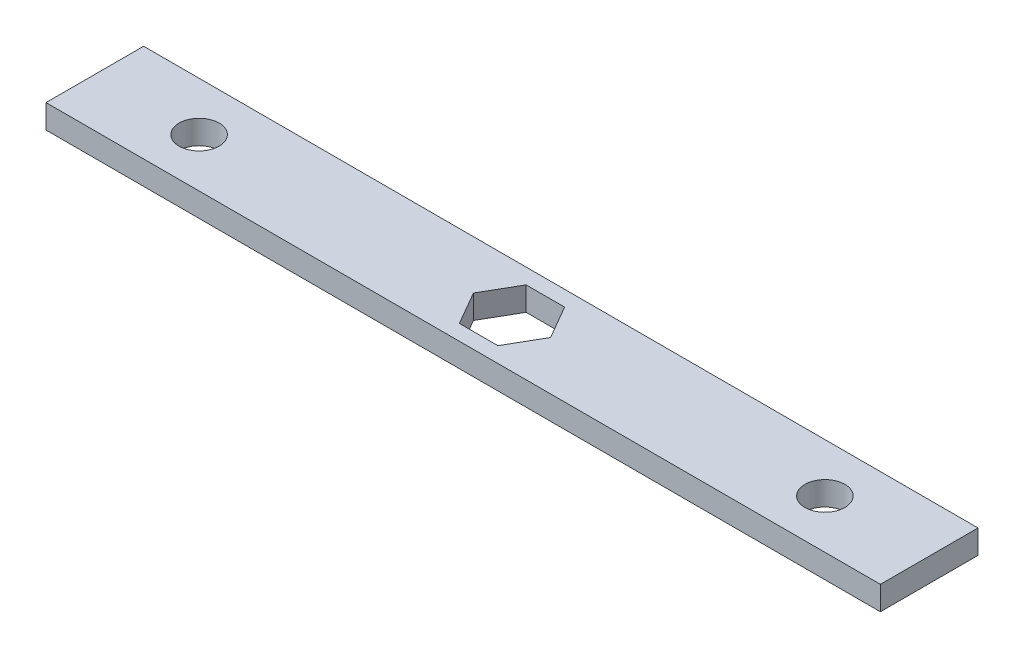
ISO-10303-21;
HEADER;
FILE_DESCRIPTION(('STEP AP214'),'2;1');
FILE_NAME('part.step','',(''),(''),'','','');
FILE_SCHEMA(('AUTOMOTIVE_DESIGN { 1 0 10303 214 1 1 1 1 }'));
ENDSEC;
DATA;
#1=APPLICATION_CONTEXT('core data for automotive mechanical design processes');
#2=APPLICATION_PROTOCOL_DEFINITION('international standard','automotive_design',2000,#1);
#3=PRODUCT_CONTEXT('',#1,'mechanical');
#4=PRODUCT('Part','Part','',(#3));
#5=PRODUCT_RELATED_PRODUCT_CATEGORY('part','',(#4));
#6=PRODUCT_DEFINITION_FORMATION('','',#4);
#7=PRODUCT_DEFINITION_CONTEXT('part definition',#1,'design');
#8=PRODUCT_DEFINITION('design','',#6,#7);
#9=PRODUCT_DEFINITION_SHAPE('','',#8);
#10=(LENGTH_UNIT() NAMED_UNIT(*) SI_UNIT(.MILLI.,.METRE.));
#11=(NAMED_UNIT(*) PLANE_ANGLE_UNIT() SI_UNIT($,.RADIAN.));
#12=(NAMED_UNIT(*) SI_UNIT($,.STERADIAN.) SOLID_ANGLE_UNIT());
#13=UNCERTAINTY_MEASURE_WITH_UNIT(LENGTH_MEASURE(1.E-05),#10,'distance_accuracy_value','');
#14=(GEOMETRIC_REPRESENTATION_CONTEXT(3) GLOBAL_UNCERTAINTY_ASSIGNED_CONTEXT((#13)) GLOBAL_UNIT_ASSIGNED_CONTEXT((#10,
#11,#12)) REPRESENTATION_CONTEXT('',''));
#15=CARTESIAN_POINT('',(0.,0.,0.));
#16=DIRECTION('',(0.,0.,1.));
#17=DIRECTION('',(1.,0.,0.));
#18=AXIS2_PLACEMENT_3D('',#15,#16,#17);
#19=CARTESIAN_POINT('',(50.,2.85,-5.85));
#20=DIRECTION('',(-1.,0.,0.));
#21=DIRECTION('',(0.,0.,1.));
#22=AXIS2_PLACEMENT_3D('',#19,#20,#21);
#23=PLANE('',#22);
#24=DIRECTION('',(0.,0.,-1.));
#25=VECTOR('',#24,1.);
#26=CARTESIAN_POINT('',(50.,0.,-5.85));
#27=LINE('',#26,#25);
#28=CARTESIAN_POINT('',(50.,0.,5.85));
#29=VERTEX_POINT('',#28);
#30=CARTESIAN_POINT('',(50.,0.,-5.85));
#31=VERTEX_POINT('',#30);
#32=EDGE_CURVE('E158',#29,#31,#27,.T.);
#33=ORIENTED_EDGE('',*,*,#32,.T.);
#34=DIRECTION('',(0.,-1.,0.));
#35=VECTOR('',#34,1.);
#36=CARTESIAN_POINT('',(50.,2.85,-5.85));
#37=LINE('',#36,#35);
#38=CARTESIAN_POINT('',(50.,2.85,-5.85));
#39=VERTEX_POINT('',#38);
#40=EDGE_CURVE('E11',#39,#31,#37,.T.);
#41=ORIENTED_EDGE('',*,*,#40,.F.);
#42=DIRECTION('',(0.,0.,-1.));
#43=VECTOR('',#42,1.);
#44=CARTESIAN_POINT('',(50.,2.85,-5.85));
#45=LINE('',#44,#43);
#46=CARTESIAN_POINT('',(50.,2.85,5.85));
#47=VERTEX_POINT('',#46);
#48=EDGE_CURVE('E166',#47,#39,#45,.T.);
#49=ORIENTED_EDGE('',*,*,#48,.F.);
#50=DIRECTION('',(0.,-1.,0.));
#51=VECTOR('',#50,1.);
#52=CARTESIAN_POINT('',(50.,2.85,5.85));
#53=LINE('',#52,#51);
#54=EDGE_CURVE('E176',#47,#29,#53,.T.);
#55=ORIENTED_EDGE('',*,*,#54,.T.);
#56=EDGE_LOOP('',(#33,#41,#49,#55));
#57=FACE_BOUND('',#56,.T.);
#58=ADVANCED_FACE('F33',(#57),#23,.F.);
#59=CARTESIAN_POINT('',(-50.,2.85,-5.85));
#60=DIRECTION('',(0.,0.,1.));
#61=DIRECTION('',(1.,0.,0.));
#62=AXIS2_PLACEMENT_3D('',#59,#60,#61);
#63=PLANE('',#62);
#64=DIRECTION('',(-1.,0.,0.));
#65=VECTOR('',#64,1.);
#66=CARTESIAN_POINT('',(-50.,0.,-5.85));
#67=LINE('',#66,#65);
#68=CARTESIAN_POINT('',(-50.,0.,-5.85));
#69=VERTEX_POINT('',#68);
#70=EDGE_CURVE('E179',#31,#69,#67,.T.);
#71=ORIENTED_EDGE('',*,*,#70,.T.);
#72=DIRECTION('',(0.,-1.,0.));
#73=VECTOR('',#72,1.);
#74=CARTESIAN_POINT('',(-50.,2.85,-5.85));
#75=LINE('',#74,#73);
#76=CARTESIAN_POINT('',(-50.,2.85,-5.85));
#77=VERTEX_POINT('',#76);
#78=EDGE_CURVE('E40',#77,#69,#75,.T.);
#79=ORIENTED_EDGE('',*,*,#78,.F.);
#80=DIRECTION('',(-1.,0.,0.));
#81=VECTOR('',#80,1.);
#82=CARTESIAN_POINT('',(-50.,2.85,-5.85));
#83=LINE('',#82,#81);
#84=EDGE_CURVE('E169',#39,#77,#83,.T.);
#85=ORIENTED_EDGE('',*,*,#84,.F.);
#86=ORIENTED_EDGE('',*,*,#40,.T.);
#87=EDGE_LOOP('',(#71,#79,#85,#86));
#88=FACE_BOUND('',#87,.T.);
#89=ADVANCED_FACE('F207',(#88),#63,.F.);
#90=CARTESIAN_POINT('',(-50.,2.85,-5.85));
#91=DIRECTION('',(1.,0.,0.));
#92=DIRECTION('',(0.,0.,-1.));
#93=AXIS2_PLACEMENT_3D('',#90,#91,#92);
#94=PLANE('',#93);
#95=DIRECTION('',(0.,0.,1.));
#96=VECTOR('',#95,1.);
#97=CARTESIAN_POINT('',(-50.,0.,-5.85));
#98=LINE('',#97,#96);
#99=CARTESIAN_POINT('',(-50.,0.,5.85));
#100=VERTEX_POINT('',#99);
#101=EDGE_CURVE('E181',#69,#100,#98,.T.);
#102=ORIENTED_EDGE('',*,*,#101,.T.);
#103=DIRECTION('',(0.,-1.,0.));
#104=VECTOR('',#103,1.);
#105=CARTESIAN_POINT('',(-50.,2.85,5.85));
#106=LINE('',#105,#104);
#107=CARTESIAN_POINT('',(-50.,2.85,5.85));
#108=VERTEX_POINT('',#107);
#109=EDGE_CURVE('E186',#108,#100,#106,.T.);
#110=ORIENTED_EDGE('',*,*,#109,.F.);
#111=DIRECTION('',(0.,0.,1.));
#112=VECTOR('',#111,1.);
#113=CARTESIAN_POINT('',(-50.,2.85,-5.85));
#114=LINE('',#113,#112);
#115=EDGE_CURVE('E172',#77,#108,#114,.T.);
#116=ORIENTED_EDGE('',*,*,#115,.F.);
#117=ORIENTED_EDGE('',*,*,#78,.T.);
#118=EDGE_LOOP('',(#102,#110,#116,#117));
#119=FACE_BOUND('',#118,.T.);
#120=ADVANCED_FACE('F193',(#119),#94,.F.);
#121=CARTESIAN_POINT('',(-50.,2.85,5.85));
#122=DIRECTION('',(0.,0.,-1.));
#123=DIRECTION('',(-1.,0.,0.));
#124=AXIS2_PLACEMENT_3D('',#121,#122,#123);
#125=PLANE('',#124);
#126=DIRECTION('',(1.,0.,0.));
#127=VECTOR('',#126,1.);
#128=CARTESIAN_POINT('',(-50.,0.,5.85));
#129=LINE('',#128,#127);
#130=EDGE_CURVE('E170',#100,#29,#129,.T.);
#131=ORIENTED_EDGE('',*,*,#130,.T.);
#132=ORIENTED_EDGE('',*,*,#54,.F.);
#133=DIRECTION('',(1.,0.,0.));
#134=VECTOR('',#133,1.);
#135=CARTESIAN_POINT('',(-50.,2.85,5.85));
#136=LINE('',#135,#134);
#137=EDGE_CURVE('E174',#108,#47,#136,.T.);
#138=ORIENTED_EDGE('',*,*,#137,.F.);
#139=ORIENTED_EDGE('',*,*,#109,.T.);
#140=EDGE_LOOP('',(#131,#132,#138,#139));
#141=FACE_BOUND('',#140,.T.);
#142=ADVANCED_FACE('F202',(#141),#125,.F.);
#143=CARTESIAN_POINT('',(0.,2.85,0.));
#144=DIRECTION('',(0.,1.,0.));
#145=DIRECTION('',(0.,0.,1.));
#146=AXIS2_PLACEMENT_3D('',#143,#144,#145);
#147=PLANE('',#146);
#148=CARTESIAN_POINT('',(37.5,2.85,0.));
#149=DIRECTION('',(0.,1.,0.));
#150=DIRECTION('',(0.,0.,1.));
#151=AXIS2_PLACEMENT_3D('',#148,#149,#150);
#152=CIRCLE('',#151,2.4);
#153=CARTESIAN_POINT('',(37.5,2.85,2.4));
#154=VERTEX_POINT('',#153);
#155=EDGE_CURVE('E257',#154,#154,#152,.T.);
#156=ORIENTED_EDGE('',*,*,#155,.F.);
#157=EDGE_LOOP('',(#156));
#158=FACE_BOUND('',#157,.T.);
#159=CARTESIAN_POINT('',(-37.5,2.85,0.));
#160=DIRECTION('',(0.,1.,0.));
#161=DIRECTION('',(0.,0.,1.));
#162=AXIS2_PLACEMENT_3D('',#159,#160,#161);
#163=CIRCLE('',#162,2.4);
#164=CARTESIAN_POINT('',(-37.5,2.85,2.4));
#165=VERTEX_POINT('',#164);
#166=EDGE_CURVE('E134',#165,#165,#163,.T.);
#167=ORIENTED_EDGE('',*,*,#166,.F.);
#168=EDGE_LOOP('',(#167));
#169=FACE_BOUND('',#168,.T.);
#170=DIRECTION('',(-0.5,0.,-0.866025403784439));
#171=VECTOR('',#170,1.);
#172=CARTESIAN_POINT('',(-4.61880215351701,2.85,0.));
#173=LINE('',#172,#171);
#174=CARTESIAN_POINT('',(-2.3094010767585,2.85,4.));
#175=VERTEX_POINT('',#174);
#176=CARTESIAN_POINT('',(-4.61880215351701,2.85,0.));
#177=VERTEX_POINT('',#176);
#178=EDGE_CURVE('E111',#175,#177,#173,.T.);
#179=ORIENTED_EDGE('',*,*,#178,.T.);
#180=DIRECTION('',(0.5,0.,-0.866025403784438));
#181=VECTOR('',#180,1.);
#182=CARTESIAN_POINT('',(-2.3094010767585,2.85,-4.));
#183=LINE('',#182,#181);
#184=CARTESIAN_POINT('',(-2.3094010767585,2.85,-4.));
#185=VERTEX_POINT('',#184);
#186=EDGE_CURVE('E120',#177,#185,#183,.T.);
#187=ORIENTED_EDGE('',*,*,#186,.T.);
#188=DIRECTION('',(1.,0.,0.));
#189=VECTOR('',#188,1.);
#190=CARTESIAN_POINT('',(2.30940107675851,2.85,-4.));
#191=LINE('',#190,#189);
#192=CARTESIAN_POINT('',(2.30940107675851,2.85,-4.));
#193=VERTEX_POINT('',#192);
#194=EDGE_CURVE('E47',#185,#193,#191,.T.);
#195=ORIENTED_EDGE('',*,*,#194,.T.);
#196=DIRECTION('',(0.5,0.,0.866025403784439));
#197=VECTOR('',#196,1.);
#198=CARTESIAN_POINT('',(4.61880215351701,2.85,0.));
#199=LINE('',#198,#197);
#200=CARTESIAN_POINT('',(4.61880215351701,2.85,0.));
#201=VERTEX_POINT('',#200);
#202=EDGE_CURVE('E138',#193,#201,#199,.T.);
#203=ORIENTED_EDGE('',*,*,#202,.T.);
#204=DIRECTION('',(-0.500000000000001,0.,0.866025403784438));
#205=VECTOR('',#204,1.);
#206=CARTESIAN_POINT('',(2.3094010767585,2.85,4.));
#207=LINE('',#206,#205);
#208=CARTESIAN_POINT('',(2.3094010767585,2.85,4.));
#209=VERTEX_POINT('',#208);
#210=EDGE_CURVE('E141',#201,#209,#207,.T.);
#211=ORIENTED_EDGE('',*,*,#210,.T.);
#212=DIRECTION('',(-1.,0.,0.));
#213=VECTOR('',#212,1.);
#214=CARTESIAN_POINT('',(-2.3094010767585,2.85,4.));
#215=LINE('',#214,#213);
#216=EDGE_CURVE('E117',#209,#175,#215,.T.);
#217=ORIENTED_EDGE('',*,*,#216,.T.);
#218=EDGE_LOOP('',(#179,#187,#195,#203,#211,#217));
#219=FACE_BOUND('',#218,.T.);
#220=ORIENTED_EDGE('',*,*,#48,.T.);
#221=ORIENTED_EDGE('',*,*,#84,.T.);
#222=ORIENTED_EDGE('',*,*,#115,.T.);
#223=ORIENTED_EDGE('',*,*,#137,.T.);
#224=EDGE_LOOP('',(#220,#221,#222,#223));
#225=FACE_BOUND('',#224,.T.);
#226=ADVANCED_FACE('F124',(#158,#169,#219,#225),#147,.T.);
#227=CARTESIAN_POINT('',(0.,0.,0.));
#228=DIRECTION('',(0.,1.,0.));
#229=DIRECTION('',(0.,0.,1.));
#230=AXIS2_PLACEMENT_3D('',#227,#228,#229);
#231=PLANE('',#230);
#232=CARTESIAN_POINT('',(37.5,0.,0.));
#233=DIRECTION('',(0.,1.,0.));
#234=DIRECTION('',(0.,0.,1.));
#235=AXIS2_PLACEMENT_3D('',#232,#233,#234);
#236=CIRCLE('',#235,2.4);
#237=CARTESIAN_POINT('',(37.5,0.,2.4));
#238=VERTEX_POINT('',#237);
#239=EDGE_CURVE('E254',#238,#238,#236,.T.);
#240=ORIENTED_EDGE('',*,*,#239,.T.);
#241=EDGE_LOOP('',(#240));
#242=FACE_BOUND('',#241,.T.);
#243=CARTESIAN_POINT('',(-37.5,0.,0.));
#244=DIRECTION('',(0.,1.,0.));
#245=DIRECTION('',(0.,0.,1.));
#246=AXIS2_PLACEMENT_3D('',#243,#244,#245);
#247=CIRCLE('',#246,2.4);
#248=CARTESIAN_POINT('',(-37.5,0.,2.4));
#249=VERTEX_POINT('',#248);
#250=EDGE_CURVE('E146',#249,#249,#247,.T.);
#251=ORIENTED_EDGE('',*,*,#250,.T.);
#252=EDGE_LOOP('',(#251));
#253=FACE_BOUND('',#252,.T.);
#254=DIRECTION('',(0.5,0.,-0.866025403784438));
#255=VECTOR('',#254,1.);
#256=CARTESIAN_POINT('',(-2.3094010767585,0.,-4.));
#257=LINE('',#256,#255);
#258=CARTESIAN_POINT('',(-4.61880215351701,0.,0.));
#259=VERTEX_POINT('',#258);
#260=CARTESIAN_POINT('',(-2.3094010767585,0.,-4.));
#261=VERTEX_POINT('',#260);
#262=EDGE_CURVE('E145',#259,#261,#257,.T.);
#263=ORIENTED_EDGE('',*,*,#262,.F.);
#264=DIRECTION('',(-0.5,0.,-0.866025403784439));
#265=VECTOR('',#264,1.);
#266=CARTESIAN_POINT('',(-4.61880215351701,0.,0.));
#267=LINE('',#266,#265);
#268=CARTESIAN_POINT('',(-2.3094010767585,0.,4.));
#269=VERTEX_POINT('',#268);
#270=EDGE_CURVE('E55',#269,#259,#267,.T.);
#271=ORIENTED_EDGE('',*,*,#270,.F.);
#272=DIRECTION('',(-1.,0.,0.));
#273=VECTOR('',#272,1.);
#274=CARTESIAN_POINT('',(-2.3094010767585,0.,4.));
#275=LINE('',#274,#273);
#276=CARTESIAN_POINT('',(2.3094010767585,0.,4.));
#277=VERTEX_POINT('',#276);
#278=EDGE_CURVE('E128',#277,#269,#275,.T.);
#279=ORIENTED_EDGE('',*,*,#278,.F.);
#280=DIRECTION('',(-0.500000000000001,0.,0.866025403784438));
#281=VECTOR('',#280,1.);
#282=CARTESIAN_POINT('',(2.3094010767585,0.,4.));
#283=LINE('',#282,#281);
#284=CARTESIAN_POINT('',(4.61880215351701,0.,0.));
#285=VERTEX_POINT('',#284);
#286=EDGE_CURVE('E131',#285,#277,#283,.T.);
#287=ORIENTED_EDGE('',*,*,#286,.F.);
#288=DIRECTION('',(0.5,0.,0.866025403784439));
#289=VECTOR('',#288,1.);
#290=CARTESIAN_POINT('',(4.61880215351701,0.,0.));
#291=LINE('',#290,#289);
#292=CARTESIAN_POINT('',(2.30940107675851,0.,-4.));
#293=VERTEX_POINT('',#292);
#294=EDGE_CURVE('E151',#293,#285,#291,.T.);
#295=ORIENTED_EDGE('',*,*,#294,.F.);
#296=DIRECTION('',(1.,0.,0.));
#297=VECTOR('',#296,1.);
#298=CARTESIAN_POINT('',(2.30940107675851,0.,-4.));
#299=LINE('',#298,#297);
#300=EDGE_CURVE('E148',#261,#293,#299,.T.);
#301=ORIENTED_EDGE('',*,*,#300,.F.);
#302=EDGE_LOOP('',(#263,#271,#279,#287,#295,#301));
#303=FACE_BOUND('',#302,.T.);
#304=ORIENTED_EDGE('',*,*,#32,.F.);
#305=ORIENTED_EDGE('',*,*,#130,.F.);
#306=ORIENTED_EDGE('',*,*,#101,.F.);
#307=ORIENTED_EDGE('',*,*,#70,.F.);
#308=EDGE_LOOP('',(#304,#305,#306,#307));
#309=FACE_BOUND('',#308,.T.);
#310=ADVANCED_FACE('F199',(#242,#253,#303,#309),#231,.F.);
#311=CARTESIAN_POINT('',(-4.61880215351701,2.85,0.));
#312=DIRECTION('',(-0.866025403784439,0.,0.5));
#313=DIRECTION('',(0.5,0.,0.866025403784439));
#314=AXIS2_PLACEMENT_3D('',#311,#312,#313);
#315=PLANE('',#314);
#316=ORIENTED_EDGE('',*,*,#270,.T.);
#317=DIRECTION('',(0.,-1.,0.));
#318=VECTOR('',#317,1.);
#319=CARTESIAN_POINT('',(-4.61880215351701,2.85,0.));
#320=LINE('',#319,#318);
#321=EDGE_CURVE('E107',#177,#259,#320,.T.);
#322=ORIENTED_EDGE('',*,*,#321,.F.);
#323=ORIENTED_EDGE('',*,*,#178,.F.);
#324=DIRECTION('',(0.,-1.,0.));
#325=VECTOR('',#324,1.);
#326=CARTESIAN_POINT('',(-2.3094010767585,2.85,4.));
#327=LINE('',#326,#325);
#328=EDGE_CURVE('E156',#175,#269,#327,.T.);
#329=ORIENTED_EDGE('',*,*,#328,.T.);
#330=EDGE_LOOP('',(#316,#322,#323,#329));
#331=FACE_BOUND('',#330,.T.);
#332=ADVANCED_FACE('F109',(#331),#315,.F.);
#333=CARTESIAN_POINT('',(-2.3094010767585,2.85,4.));
#334=DIRECTION('',(0.,0.,1.));
#335=DIRECTION('',(1.,0.,0.));
#336=AXIS2_PLACEMENT_3D('',#333,#334,#335);
#337=PLANE('',#336);
#338=ORIENTED_EDGE('',*,*,#278,.T.);
#339=ORIENTED_EDGE('',*,*,#328,.F.);
#340=ORIENTED_EDGE('',*,*,#216,.F.);
#341=DIRECTION('',(0.,-1.,0.));
#342=VECTOR('',#341,1.);
#343=CARTESIAN_POINT('',(2.3094010767585,2.85,4.));
#344=LINE('',#343,#342);
#345=EDGE_CURVE('E159',#209,#277,#344,.T.);
#346=ORIENTED_EDGE('',*,*,#345,.T.);
#347=EDGE_LOOP('',(#338,#339,#340,#346));
#348=FACE_BOUND('',#347,.T.);
#349=ADVANCED_FACE('F225',(#348),#337,.F.);
#350=CARTESIAN_POINT('',(2.3094010767585,2.85,4.));
#351=DIRECTION('',(0.866025403784438,0.,0.500000000000001));
#352=DIRECTION('',(0.500000000000001,0.,-0.866025403784438));
#353=AXIS2_PLACEMENT_3D('',#350,#351,#352);
#354=PLANE('',#353);
#355=ORIENTED_EDGE('',*,*,#286,.T.);
#356=ORIENTED_EDGE('',*,*,#345,.F.);
#357=ORIENTED_EDGE('',*,*,#210,.F.);
#358=DIRECTION('',(0.,-1.,0.));
#359=VECTOR('',#358,1.);
#360=CARTESIAN_POINT('',(4.61880215351701,2.85,0.));
#361=LINE('',#360,#359);
#362=EDGE_CURVE('E161',#201,#285,#361,.T.);
#363=ORIENTED_EDGE('',*,*,#362,.T.);
#364=EDGE_LOOP('',(#355,#356,#357,#363));
#365=FACE_BOUND('',#364,.T.);
#366=ADVANCED_FACE('F235',(#365),#354,.F.);
#367=CARTESIAN_POINT('',(4.61880215351701,2.85,0.));
#368=DIRECTION('',(0.866025403784439,0.,-0.5));
#369=DIRECTION('',(-0.5,0.,-0.866025403784439));
#370=AXIS2_PLACEMENT_3D('',#367,#368,#369);
#371=PLANE('',#370);
#372=ORIENTED_EDGE('',*,*,#294,.T.);
#373=ORIENTED_EDGE('',*,*,#362,.F.);
#374=ORIENTED_EDGE('',*,*,#202,.F.);
#375=DIRECTION('',(0.,-1.,0.));
#376=VECTOR('',#375,1.);
#377=CARTESIAN_POINT('',(2.30940107675851,2.85,-4.));
#378=LINE('',#377,#376);
#379=EDGE_CURVE('E163',#193,#293,#378,.T.);
#380=ORIENTED_EDGE('',*,*,#379,.T.);
#381=EDGE_LOOP('',(#372,#373,#374,#380));
#382=FACE_BOUND('',#381,.T.);
#383=ADVANCED_FACE('F232',(#382),#371,.F.);
#384=CARTESIAN_POINT('',(2.30940107675851,2.85,-4.));
#385=DIRECTION('',(0.,0.,-1.));
#386=DIRECTION('',(-1.,0.,0.));
#387=AXIS2_PLACEMENT_3D('',#384,#385,#386);
#388=PLANE('',#387);
#389=ORIENTED_EDGE('',*,*,#300,.T.);
#390=ORIENTED_EDGE('',*,*,#379,.F.);
#391=ORIENTED_EDGE('',*,*,#194,.F.);
#392=DIRECTION('',(0.,-1.,0.));
#393=VECTOR('',#392,1.);
#394=CARTESIAN_POINT('',(-2.3094010767585,2.85,-4.));
#395=LINE('',#394,#393);
#396=EDGE_CURVE('E116',#185,#261,#395,.T.);
#397=ORIENTED_EDGE('',*,*,#396,.T.);
#398=EDGE_LOOP('',(#389,#390,#391,#397));
#399=FACE_BOUND('',#398,.T.);
#400=ADVANCED_FACE('F229',(#399),#388,.F.);
#401=CARTESIAN_POINT('',(-2.3094010767585,2.85,-4.));
#402=DIRECTION('',(-0.866025403784438,0.,-0.5));
#403=DIRECTION('',(-0.5,0.,0.866025403784439));
#404=AXIS2_PLACEMENT_3D('',#401,#402,#403);
#405=PLANE('',#404);
#406=ORIENTED_EDGE('',*,*,#262,.T.);
#407=ORIENTED_EDGE('',*,*,#396,.F.);
#408=ORIENTED_EDGE('',*,*,#186,.F.);
#409=ORIENTED_EDGE('',*,*,#321,.T.);
#410=EDGE_LOOP('',(#406,#407,#408,#409));
#411=FACE_BOUND('',#410,.T.);
#412=ADVANCED_FACE('F121',(#411),#405,.F.);
#413=CARTESIAN_POINT('',(-37.5,0.,0.));
#414=DIRECTION('',(0.,1.,0.));
#415=DIRECTION('',(0.,0.,1.));
#416=AXIS2_PLACEMENT_3D('',#413,#414,#415);
#417=CYLINDRICAL_SURFACE('',#416,2.4);
#418=ORIENTED_EDGE('',*,*,#250,.F.);
#419=EDGE_LOOP('',(#418));
#420=FACE_BOUND('',#419,.T.);
#421=ORIENTED_EDGE('',*,*,#166,.T.);
#422=EDGE_LOOP('',(#421));
#423=FACE_BOUND('',#422,.T.);
#424=ADVANCED_FACE('F228',(#420,#423),#417,.F.);
#425=CARTESIAN_POINT('',(37.5,0.,0.));
#426=DIRECTION('',(0.,1.,0.));
#427=DIRECTION('',(0.,0.,1.));
#428=AXIS2_PLACEMENT_3D('',#425,#426,#427);
#429=CYLINDRICAL_SURFACE('',#428,2.4);
#430=ORIENTED_EDGE('',*,*,#239,.F.);
#431=EDGE_LOOP('',(#430));
#432=FACE_BOUND('',#431,.T.);
#433=ORIENTED_EDGE('',*,*,#155,.T.);
#434=EDGE_LOOP('',(#433));
#435=FACE_BOUND('',#434,.T.);
#436=ADVANCED_FACE('F245',(#432,#435),#429,.F.);
#437=CLOSED_SHELL('',(#58,#89,#120,#142,#226,#310,#332,#349,#366,#383,#400,#412,#424,#436));
#438=MANIFOLD_SOLID_BREP('B2',#437);
#439=ADVANCED_BREP_SHAPE_REPRESENTATION('',(#18,#438),#14);
#440=SHAPE_DEFINITION_REPRESENTATION(#9,#439);
ENDSEC;
END-ISO-10303-21;
